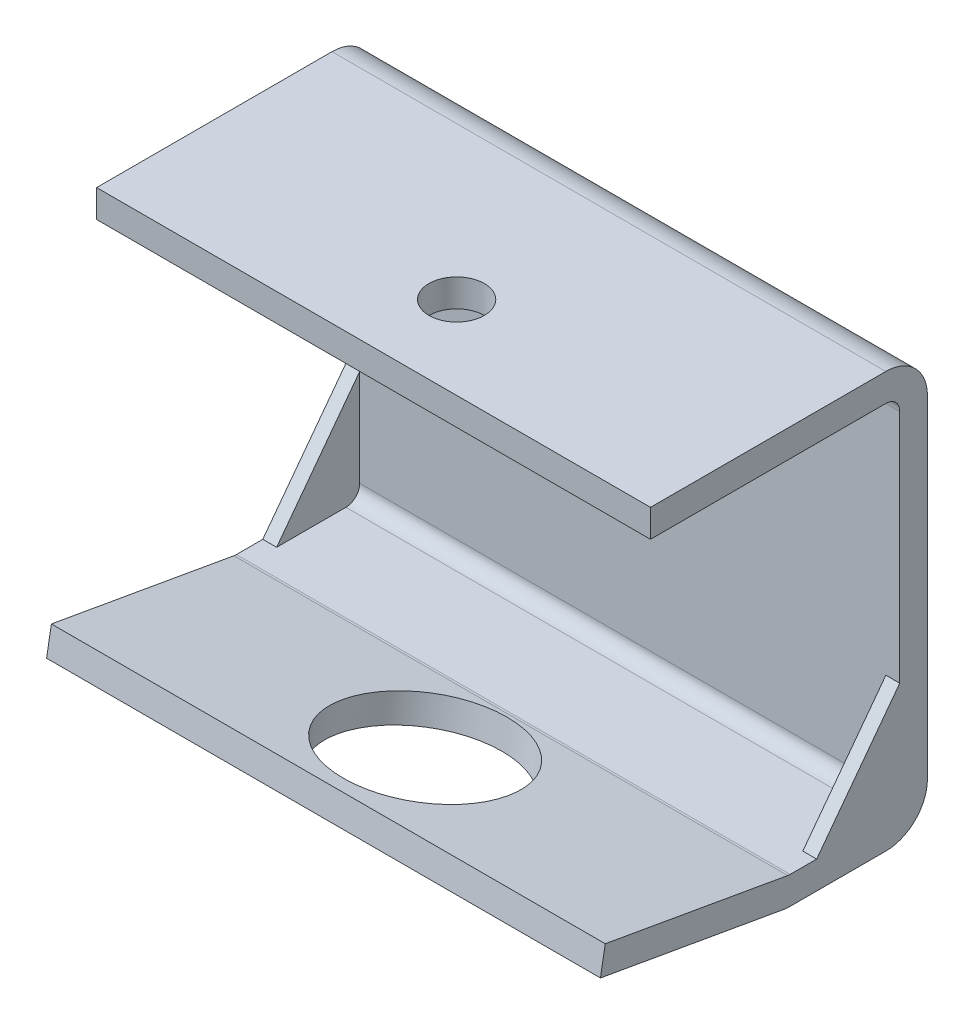
ISO-10303-21;
HEADER;
FILE_DESCRIPTION(('STEP AP214'),'2;1');
FILE_NAME('part.step','',(''),(''),'','','');
FILE_SCHEMA(('AUTOMOTIVE_DESIGN { 1 0 10303 214 1 1 1 1 }'));
ENDSEC;
DATA;
#1=APPLICATION_CONTEXT('core data for automotive mechanical design processes');
#2=APPLICATION_PROTOCOL_DEFINITION('international standard','automotive_design',2000,#1);
#3=PRODUCT_CONTEXT('',#1,'mechanical');
#4=PRODUCT('Part','Part','',(#3));
#5=PRODUCT_RELATED_PRODUCT_CATEGORY('part','',(#4));
#6=PRODUCT_DEFINITION_FORMATION('','',#4);
#7=PRODUCT_DEFINITION_CONTEXT('part definition',#1,'design');
#8=PRODUCT_DEFINITION('design','',#6,#7);
#9=PRODUCT_DEFINITION_SHAPE('','',#8);
#10=(LENGTH_UNIT() NAMED_UNIT(*) SI_UNIT(.MILLI.,.METRE.));
#11=(NAMED_UNIT(*) PLANE_ANGLE_UNIT() SI_UNIT($,.RADIAN.));
#12=(NAMED_UNIT(*) SI_UNIT($,.STERADIAN.) SOLID_ANGLE_UNIT());
#13=UNCERTAINTY_MEASURE_WITH_UNIT(LENGTH_MEASURE(1.E-05),#10,'distance_accuracy_value','');
#14=(GEOMETRIC_REPRESENTATION_CONTEXT(3) GLOBAL_UNCERTAINTY_ASSIGNED_CONTEXT((#13)) GLOBAL_UNIT_ASSIGNED_CONTEXT((#10,
#11,#12)) REPRESENTATION_CONTEXT('',''));
#15=CARTESIAN_POINT('',(0.,0.,0.));
#16=DIRECTION('',(0.,0.,1.));
#17=DIRECTION('',(1.,0.,0.));
#18=AXIS2_PLACEMENT_3D('',#15,#16,#17);
#19=CARTESIAN_POINT('',(63.5,3.175,3.175));
#20=DIRECTION('',(-1.,0.,0.));
#21=DIRECTION('',(0.,0.,1.));
#22=AXIS2_PLACEMENT_3D('',#19,#20,#21);
#23=CYLINDRICAL_SURFACE('',#22,3.175);
#24=DIRECTION('',(-1.,0.,0.));
#25=VECTOR('',#24,1.);
#26=CARTESIAN_POINT('',(63.5,3.175,0.));
#27=LINE('',#26,#25);
#28=CARTESIAN_POINT('',(60.325,3.175,0.));
#29=VERTEX_POINT('',#28);
#30=CARTESIAN_POINT('',(-60.325,3.175,0.));
#31=VERTEX_POINT('',#30);
#32=EDGE_CURVE('E331',#29,#31,#27,.T.);
#33=ORIENTED_EDGE('',*,*,#32,.T.);
#34=CARTESIAN_POINT('',(-60.325,3.175,3.175));
#35=DIRECTION('',(1.,0.,0.));
#36=DIRECTION('',(0.,0.,-1.));
#37=AXIS2_PLACEMENT_3D('',#34,#35,#36);
#38=CIRCLE('',#37,3.175);
#39=CARTESIAN_POINT('',(-60.325,0.,3.175));
#40=VERTEX_POINT('',#39);
#41=EDGE_CURVE('E203',#40,#31,#38,.T.);
#42=ORIENTED_EDGE('',*,*,#41,.F.);
#43=DIRECTION('',(-1.,0.,0.));
#44=VECTOR('',#43,1.);
#45=CARTESIAN_POINT('',(63.5,0.,3.175));
#46=LINE('',#45,#44);
#47=CARTESIAN_POINT('',(60.325,0.,3.175));
#48=VERTEX_POINT('',#47);
#49=EDGE_CURVE('E202',#48,#40,#46,.T.);
#50=ORIENTED_EDGE('',*,*,#49,.F.);
#51=CARTESIAN_POINT('',(60.325,3.175,3.175));
#52=DIRECTION('',(1.,0.,0.));
#53=DIRECTION('',(0.,0.,-1.));
#54=AXIS2_PLACEMENT_3D('',#51,#52,#53);
#55=CIRCLE('',#54,3.175);
#56=EDGE_CURVE('E214',#48,#29,#55,.T.);
#57=ORIENTED_EDGE('',*,*,#56,.T.);
#58=EDGE_LOOP('',(#33,#42,#50,#57));
#59=FACE_BOUND('',#58,.T.);
#60=ADVANCED_FACE('F43',(#59),#23,.F.);
#61=CARTESIAN_POINT('',(63.5,3.175,0.));
#62=DIRECTION('',(0.,0.,1.));
#63=DIRECTION('',(1.,0.,0.));
#64=AXIS2_PLACEMENT_3D('',#61,#62,#63);
#65=PLANE('',#64);
#66=DIRECTION('',(-1.,0.,0.));
#67=VECTOR('',#66,1.);
#68=CARTESIAN_POINT('',(-60.325,25.4,0.));
#69=LINE('',#68,#67);
#70=CARTESIAN_POINT('',(-60.325,25.4,0.));
#71=VERTEX_POINT('',#70);
#72=CARTESIAN_POINT('',(-63.5,25.4,0.));
#73=VERTEX_POINT('',#72);
#74=EDGE_CURVE('E190',#71,#73,#69,.T.);
#75=ORIENTED_EDGE('',*,*,#74,.F.);
#76=DIRECTION('',(0.,1.,0.));
#77=VECTOR('',#76,1.);
#78=CARTESIAN_POINT('',(-60.325,3.175,0.));
#79=LINE('',#78,#77);
#80=EDGE_CURVE('E197',#31,#71,#79,.T.);
#81=ORIENTED_EDGE('',*,*,#80,.F.);
#82=ORIENTED_EDGE('',*,*,#32,.F.);
#83=DIRECTION('',(0.,1.,0.));
#84=VECTOR('',#83,1.);
#85=CARTESIAN_POINT('',(60.325,3.175,0.));
#86=LINE('',#85,#84);
#87=CARTESIAN_POINT('',(60.325,25.4,0.));
#88=VERTEX_POINT('',#87);
#89=EDGE_CURVE('E67',#29,#88,#86,.T.);
#90=ORIENTED_EDGE('',*,*,#89,.T.);
#91=DIRECTION('',(1.,0.,0.));
#92=VECTOR('',#91,1.);
#93=CARTESIAN_POINT('',(60.325,25.4,0.));
#94=LINE('',#93,#92);
#95=CARTESIAN_POINT('',(63.5,25.4,0.));
#96=VERTEX_POINT('',#95);
#97=EDGE_CURVE('E223',#88,#96,#94,.T.);
#98=ORIENTED_EDGE('',*,*,#97,.T.);
#99=DIRECTION('',(0.,1.,0.));
#100=VECTOR('',#99,1.);
#101=CARTESIAN_POINT('',(63.5,3.175,0.));
#102=LINE('',#101,#100);
#103=CARTESIAN_POINT('',(63.5,79.375,0.));
#104=VERTEX_POINT('',#103);
#105=EDGE_CURVE('E244',#96,#104,#102,.T.);
#106=ORIENTED_EDGE('',*,*,#105,.T.);
#107=DIRECTION('',(-1.,0.,0.));
#108=VECTOR('',#107,1.);
#109=CARTESIAN_POINT('',(63.5,79.375,0.));
#110=LINE('',#109,#108);
#111=CARTESIAN_POINT('',(-63.5,79.375,0.));
#112=VERTEX_POINT('',#111);
#113=EDGE_CURVE('E334',#104,#112,#110,.T.);
#114=ORIENTED_EDGE('',*,*,#113,.T.);
#115=DIRECTION('',(0.,1.,0.));
#116=VECTOR('',#115,1.);
#117=CARTESIAN_POINT('',(-63.5,3.175,0.));
#118=LINE('',#117,#116);
#119=EDGE_CURVE('E281',#73,#112,#118,.T.);
#120=ORIENTED_EDGE('',*,*,#119,.F.);
#121=EDGE_LOOP('',(#75,#81,#82,#90,#98,#106,#114,#120));
#122=FACE_BOUND('',#121,.T.);
#123=ADVANCED_FACE('F424',(#122),#65,.T.);
#124=CARTESIAN_POINT('',(63.5,0.,25.1222234933052));
#125=DIRECTION('',(0.,1.,0.));
#126=DIRECTION('',(0.,0.,1.));
#127=AXIS2_PLACEMENT_3D('',#124,#125,#126);
#128=PLANE('',#127);
#129=DIRECTION('',(-1.,0.,0.));
#130=VECTOR('',#129,1.);
#131=CARTESIAN_POINT('',(-60.325,0.,19.05));
#132=LINE('',#131,#130);
#133=CARTESIAN_POINT('',(-60.325,0.,19.05));
#134=VERTEX_POINT('',#133);
#135=CARTESIAN_POINT('',(-63.5,0.,19.05));
#136=VERTEX_POINT('',#135);
#137=EDGE_CURVE('E181',#134,#136,#132,.T.);
#138=ORIENTED_EDGE('',*,*,#137,.T.);
#139=DIRECTION('',(0.,0.,-1.));
#140=VECTOR('',#139,1.);
#141=CARTESIAN_POINT('',(-63.5,0.,25.1222234933052));
#142=LINE('',#141,#140);
#143=CARTESIAN_POINT('',(-63.5,0.,25.1222234933052));
#144=VERTEX_POINT('',#143);
#145=EDGE_CURVE('E283',#144,#136,#142,.T.);
#146=ORIENTED_EDGE('',*,*,#145,.F.);
#147=DIRECTION('',(-1.,0.,0.));
#148=VECTOR('',#147,1.);
#149=CARTESIAN_POINT('',(63.5,0.,25.1222234933052));
#150=LINE('',#149,#148);
#151=CARTESIAN_POINT('',(63.5,0.,25.1222234933052));
#152=VERTEX_POINT('',#151);
#153=EDGE_CURVE('E328',#152,#144,#150,.T.);
#154=ORIENTED_EDGE('',*,*,#153,.F.);
#155=DIRECTION('',(0.,0.,-1.));
#156=VECTOR('',#155,1.);
#157=CARTESIAN_POINT('',(63.5,0.,25.1222234933052));
#158=LINE('',#157,#156);
#159=CARTESIAN_POINT('',(63.5,0.,19.05));
#160=VERTEX_POINT('',#159);
#161=EDGE_CURVE('E246',#152,#160,#158,.T.);
#162=ORIENTED_EDGE('',*,*,#161,.T.);
#163=DIRECTION('',(1.,0.,0.));
#164=VECTOR('',#163,1.);
#165=CARTESIAN_POINT('',(60.325,0.,19.05));
#166=LINE('',#165,#164);
#167=CARTESIAN_POINT('',(60.325,0.,19.05));
#168=VERTEX_POINT('',#167);
#169=EDGE_CURVE('E218',#168,#160,#166,.T.);
#170=ORIENTED_EDGE('',*,*,#169,.F.);
#171=DIRECTION('',(0.,0.,-1.));
#172=VECTOR('',#171,1.);
#173=CARTESIAN_POINT('',(60.325,0.,19.05));
#174=LINE('',#173,#172);
#175=EDGE_CURVE('E216',#168,#48,#174,.T.);
#176=ORIENTED_EDGE('',*,*,#175,.T.);
#177=ORIENTED_EDGE('',*,*,#49,.T.);
#178=DIRECTION('',(0.,0.,-1.));
#179=VECTOR('',#178,1.);
#180=CARTESIAN_POINT('',(-60.325,0.,19.05));
#181=LINE('',#180,#179);
#182=EDGE_CURVE('E194',#134,#40,#181,.T.);
#183=ORIENTED_EDGE('',*,*,#182,.F.);
#184=EDGE_LOOP('',(#138,#146,#154,#162,#170,#176,#177,#183));
#185=FACE_BOUND('',#184,.T.);
#186=ADVANCED_FACE('F200',(#185),#128,.T.);
#187=CARTESIAN_POINT('',(63.5,88.9,3.175));
#188=DIRECTION('',(0.,-1.,0.));
#189=DIRECTION('',(0.,0.,-1.));
#190=AXIS2_PLACEMENT_3D('',#187,#188,#189);
#191=PLANE('',#190);
#192=CARTESIAN_POINT('',(0.,88.9,38.1));
#193=DIRECTION('',(0.,1.,0.));
#194=DIRECTION('',(0.,0.,1.));
#195=AXIS2_PLACEMENT_3D('',#192,#193,#194);
#196=CIRCLE('',#195,6.35);
#197=CARTESIAN_POINT('',(0.,88.9,44.45));
#198=VERTEX_POINT('',#197);
#199=EDGE_CURVE('E228',#198,#198,#196,.T.);
#200=ORIENTED_EDGE('',*,*,#199,.F.);
#201=EDGE_LOOP('',(#200));
#202=FACE_BOUND('',#201,.T.);
#203=DIRECTION('',(0.,0.,1.));
#204=VECTOR('',#203,1.);
#205=CARTESIAN_POINT('',(-63.5,88.9,3.175));
#206=LINE('',#205,#204);
#207=CARTESIAN_POINT('',(-63.5,88.9,3.175));
#208=VERTEX_POINT('',#207);
#209=CARTESIAN_POINT('',(-63.5,88.9,57.15));
#210=VERTEX_POINT('',#209);
#211=EDGE_CURVE('E231',#208,#210,#206,.T.);
#212=ORIENTED_EDGE('',*,*,#211,.T.);
#213=DIRECTION('',(-1.,0.,0.));
#214=VECTOR('',#213,1.);
#215=CARTESIAN_POINT('',(63.5,88.9,57.15));
#216=LINE('',#215,#214);
#217=CARTESIAN_POINT('',(63.5,88.9,57.15));
#218=VERTEX_POINT('',#217);
#219=EDGE_CURVE('E13',#218,#210,#216,.T.);
#220=ORIENTED_EDGE('',*,*,#219,.F.);
#221=DIRECTION('',(0.,0.,1.));
#222=VECTOR('',#221,1.);
#223=CARTESIAN_POINT('',(63.5,88.9,3.175));
#224=LINE('',#223,#222);
#225=CARTESIAN_POINT('',(63.5,88.9,3.175));
#226=VERTEX_POINT('',#225);
#227=EDGE_CURVE('E232',#226,#218,#224,.T.);
#228=ORIENTED_EDGE('',*,*,#227,.F.);
#229=DIRECTION('',(-1.,0.,0.));
#230=VECTOR('',#229,1.);
#231=CARTESIAN_POINT('',(63.5,88.9,3.175));
#232=LINE('',#231,#230);
#233=EDGE_CURVE('E269',#226,#208,#232,.T.);
#234=ORIENTED_EDGE('',*,*,#233,.T.);
#235=EDGE_LOOP('',(#212,#220,#228,#234));
#236=FACE_BOUND('',#235,.T.);
#237=ADVANCED_FACE('F45',(#202,#236),#191,.F.);
#238=CARTESIAN_POINT('',(63.5,82.55,57.15));
#239=DIRECTION('',(0.,0.,1.));
#240=DIRECTION('',(1.,0.,0.));
#241=AXIS2_PLACEMENT_3D('',#238,#239,#240);
#242=PLANE('',#241);
#243=DIRECTION('',(0.,1.,0.));
#244=VECTOR('',#243,1.);
#245=CARTESIAN_POINT('',(-63.5,82.55,57.15));
#246=LINE('',#245,#244);
#247=CARTESIAN_POINT('',(-63.5,82.55,57.15));
#248=VERTEX_POINT('',#247);
#249=EDGE_CURVE('E272',#248,#210,#246,.T.);
#250=ORIENTED_EDGE('',*,*,#249,.F.);
#251=DIRECTION('',(-1.,0.,0.));
#252=VECTOR('',#251,1.);
#253=CARTESIAN_POINT('',(63.5,82.55,57.15));
#254=LINE('',#253,#252);
#255=CARTESIAN_POINT('',(63.5,82.55,57.15));
#256=VERTEX_POINT('',#255);
#257=EDGE_CURVE('E52',#256,#248,#254,.T.);
#258=ORIENTED_EDGE('',*,*,#257,.F.);
#259=DIRECTION('',(0.,1.,0.));
#260=VECTOR('',#259,1.);
#261=CARTESIAN_POINT('',(63.5,82.55,57.15));
#262=LINE('',#261,#260);
#263=EDGE_CURVE('E234',#256,#218,#262,.T.);
#264=ORIENTED_EDGE('',*,*,#263,.T.);
#265=ORIENTED_EDGE('',*,*,#219,.T.);
#266=EDGE_LOOP('',(#250,#258,#264,#265));
#267=FACE_BOUND('',#266,.T.);
#268=ADVANCED_FACE('F346',(#267),#242,.T.);
#269=CARTESIAN_POINT('',(63.5,82.55,3.175));
#270=DIRECTION('',(0.,-1.,0.));
#271=DIRECTION('',(0.,0.,-1.));
#272=AXIS2_PLACEMENT_3D('',#269,#270,#271);
#273=PLANE('',#272);
#274=CARTESIAN_POINT('',(0.,82.55,38.1));
#275=DIRECTION('',(0.,-1.,0.));
#276=DIRECTION('',(0.,0.,-1.));
#277=AXIS2_PLACEMENT_3D('',#274,#275,#276);
#278=CIRCLE('',#277,6.35);
#279=CARTESIAN_POINT('',(0.,82.55,31.75));
#280=VERTEX_POINT('',#279);
#281=EDGE_CURVE('E225',#280,#280,#278,.F.);
#282=ORIENTED_EDGE('',*,*,#281,.T.);
#283=EDGE_LOOP('',(#282));
#284=FACE_BOUND('',#283,.T.);
#285=DIRECTION('',(0.,0.,1.));
#286=VECTOR('',#285,1.);
#287=CARTESIAN_POINT('',(-63.5,82.55,3.175));
#288=LINE('',#287,#286);
#289=CARTESIAN_POINT('',(-63.5,82.55,3.175));
#290=VERTEX_POINT('',#289);
#291=EDGE_CURVE('E275',#290,#248,#288,.T.);
#292=ORIENTED_EDGE('',*,*,#291,.F.);
#293=DIRECTION('',(-1.,0.,0.));
#294=VECTOR('',#293,1.);
#295=CARTESIAN_POINT('',(63.5,82.55,3.175));
#296=LINE('',#295,#294);
#297=CARTESIAN_POINT('',(63.5,82.55,3.175));
#298=VERTEX_POINT('',#297);
#299=EDGE_CURVE('E337',#298,#290,#296,.T.);
#300=ORIENTED_EDGE('',*,*,#299,.F.);
#301=DIRECTION('',(0.,0.,1.));
#302=VECTOR('',#301,1.);
#303=CARTESIAN_POINT('',(63.5,82.55,3.175));
#304=LINE('',#303,#302);
#305=EDGE_CURVE('E238',#298,#256,#304,.T.);
#306=ORIENTED_EDGE('',*,*,#305,.T.);
#307=ORIENTED_EDGE('',*,*,#257,.T.);
#308=EDGE_LOOP('',(#292,#300,#306,#307));
#309=FACE_BOUND('',#308,.T.);
#310=ADVANCED_FACE('F342',(#284,#309),#273,.T.);
#311=CARTESIAN_POINT('',(63.5,79.375,3.175));
#312=DIRECTION('',(-1.,0.,0.));
#313=DIRECTION('',(0.,0.,1.));
#314=AXIS2_PLACEMENT_3D('',#311,#312,#313);
#315=CYLINDRICAL_SURFACE('',#314,3.175);
#316=CARTESIAN_POINT('',(-63.5,79.375,3.175));
#317=DIRECTION('',(1.,0.,0.));
#318=DIRECTION('',(0.,0.,-1.));
#319=AXIS2_PLACEMENT_3D('',#316,#317,#318);
#320=CIRCLE('',#319,3.175);
#321=EDGE_CURVE('E278',#112,#290,#320,.T.);
#322=ORIENTED_EDGE('',*,*,#321,.F.);
#323=ORIENTED_EDGE('',*,*,#113,.F.);
#324=CARTESIAN_POINT('',(63.5,79.375,3.175));
#325=DIRECTION('',(1.,0.,0.));
#326=DIRECTION('',(0.,0.,-1.));
#327=AXIS2_PLACEMENT_3D('',#324,#325,#326);
#328=CIRCLE('',#327,3.175);
#329=EDGE_CURVE('E241',#104,#298,#328,.T.);
#330=ORIENTED_EDGE('',*,*,#329,.T.);
#331=ORIENTED_EDGE('',*,*,#299,.T.);
#332=EDGE_LOOP('',(#322,#323,#330,#331));
#333=FACE_BOUND('',#332,.T.);
#334=ADVANCED_FACE('F354',(#333),#315,.F.);
#335=CARTESIAN_POINT('',(63.5,3.175,25.1222234933052));
#336=DIRECTION('',(-1.,0.,0.));
#337=DIRECTION('',(0.,0.,1.));
#338=AXIS2_PLACEMENT_3D('',#335,#336,#337);
#339=CYLINDRICAL_SURFACE('',#338,3.175);
#340=CARTESIAN_POINT('',(-63.5,3.175,25.1222234933052));
#341=DIRECTION('',(1.,0.,0.));
#342=DIRECTION('',(0.,0.,-1.));
#343=AXIS2_PLACEMENT_3D('',#340,#341,#342);
#344=CIRCLE('',#343,3.175);
#345=CARTESIAN_POINT('',(-63.5,0.0482353841862421,25.6735564573977));
#346=VERTEX_POINT('',#345);
#347=EDGE_CURVE('E285',#346,#144,#344,.T.);
#348=ORIENTED_EDGE('',*,*,#347,.F.);
#349=DIRECTION('',(-1.,0.,0.));
#350=VECTOR('',#349,1.);
#351=CARTESIAN_POINT('',(63.5,0.0482353841862421,25.6735564573977));
#352=LINE('',#351,#350);
#353=CARTESIAN_POINT('',(63.5,0.0482353841862421,25.6735564573977));
#354=VERTEX_POINT('',#353);
#355=EDGE_CURVE('E326',#354,#346,#352,.T.);
#356=ORIENTED_EDGE('',*,*,#355,.F.);
#357=CARTESIAN_POINT('',(63.5,3.175,25.1222234933052));
#358=DIRECTION('',(1.,0.,0.));
#359=DIRECTION('',(0.,0.,-1.));
#360=AXIS2_PLACEMENT_3D('',#357,#358,#359);
#361=CIRCLE('',#360,3.175);
#362=EDGE_CURVE('E248',#354,#152,#361,.T.);
#363=ORIENTED_EDGE('',*,*,#362,.T.);
#364=ORIENTED_EDGE('',*,*,#153,.T.);
#365=EDGE_LOOP('',(#348,#356,#363,#364));
#366=FACE_BOUND('',#365,.T.);
#367=ADVANCED_FACE('F401',(#366),#339,.F.);
#368=CARTESIAN_POINT('',(63.5,7.42755769225423,67.523772904243));
#369=DIRECTION('',(0.,0.984807753012208,-0.173648177666931));
#370=DIRECTION('',(0.,0.173648177666931,0.984807753012208));
#371=AXIS2_PLACEMENT_3D('',#368,#369,#370);
#372=PLANE('',#371);
#373=CARTESIAN_POINT('',(-3.42687350455541E-13,3.51215941315118,45.3184458274035));
#374=DIRECTION('',(0.,0.984807753012208,-0.173648177666931));
#375=DIRECTION('',(0.,0.173648177666931,0.984807753012208));
#376=AXIS2_PLACEMENT_3D('',#373,#374,#375);
#377=CIRCLE('',#376,19.05);
#378=CARTESIAN_POINT('',(-3.42687350455541E-13,6.82015719770621,64.079033522286));
#379=VERTEX_POINT('',#378);
#380=EDGE_CURVE('E558',#379,#379,#377,.T.);
#381=ORIENTED_EDGE('',*,*,#380,.F.);
#382=EDGE_LOOP('',(#381));
#383=FACE_BOUND('',#382,.T.);
#384=DIRECTION('',(0.,-0.173648177666931,-0.984807753012208));
#385=VECTOR('',#384,1.);
#386=CARTESIAN_POINT('',(-63.5,7.42755769225423,67.523772904243));
#387=LINE('',#386,#385);
#388=CARTESIAN_POINT('',(-63.5,7.42755769225423,67.523772904243));
#389=VERTEX_POINT('',#388);
#390=EDGE_CURVE('E288',#389,#346,#387,.T.);
#391=ORIENTED_EDGE('',*,*,#390,.F.);
#392=DIRECTION('',(-1.,0.,0.));
#393=VECTOR('',#392,1.);
#394=CARTESIAN_POINT('',(63.5,7.42755769225423,67.523772904243));
#395=LINE('',#394,#393);
#396=CARTESIAN_POINT('',(63.5,7.42755769225423,67.523772904243));
#397=VERTEX_POINT('',#396);
#398=EDGE_CURVE('E324',#397,#389,#395,.T.);
#399=ORIENTED_EDGE('',*,*,#398,.F.);
#400=DIRECTION('',(0.,-0.173648177666931,-0.984807753012208));
#401=VECTOR('',#400,1.);
#402=CARTESIAN_POINT('',(63.5,7.42755769225423,67.523772904243));
#403=LINE('',#402,#401);
#404=EDGE_CURVE('E251',#397,#354,#403,.T.);
#405=ORIENTED_EDGE('',*,*,#404,.T.);
#406=ORIENTED_EDGE('',*,*,#355,.T.);
#407=EDGE_LOOP('',(#391,#399,#405,#406));
#408=FACE_BOUND('',#407,.T.);
#409=ADVANCED_FACE('F398',(#383,#408),#372,.T.);
#410=CARTESIAN_POINT('',(63.5,1.17402846062671,68.626438832428));
#411=DIRECTION('',(0.,0.17364817766693,0.984807753012208));
#412=DIRECTION('',(0.,-0.984807753012208,0.17364817766693));
#413=AXIS2_PLACEMENT_3D('',#410,#411,#412);
#414=PLANE('',#413);
#415=DIRECTION('',(0.,0.984807753012208,-0.17364817766693));
#416=VECTOR('',#415,1.);
#417=CARTESIAN_POINT('',(-63.5,1.17402846062671,68.626438832428));
#418=LINE('',#417,#416);
#419=CARTESIAN_POINT('',(-63.5,1.17402846062671,68.626438832428));
#420=VERTEX_POINT('',#419);
#421=EDGE_CURVE('E291',#420,#389,#418,.T.);
#422=ORIENTED_EDGE('',*,*,#421,.F.);
#423=DIRECTION('',(-1.,0.,0.));
#424=VECTOR('',#423,1.);
#425=CARTESIAN_POINT('',(63.5,1.17402846062671,68.626438832428));
#426=LINE('',#425,#424);
#427=CARTESIAN_POINT('',(63.5,1.17402846062671,68.626438832428));
#428=VERTEX_POINT('',#427);
#429=EDGE_CURVE('E322',#428,#420,#426,.T.);
#430=ORIENTED_EDGE('',*,*,#429,.F.);
#431=DIRECTION('',(0.,0.984807753012208,-0.17364817766693));
#432=VECTOR('',#431,1.);
#433=CARTESIAN_POINT('',(63.5,1.17402846062671,68.626438832428));
#434=LINE('',#433,#432);
#435=EDGE_CURVE('E254',#428,#397,#434,.T.);
#436=ORIENTED_EDGE('',*,*,#435,.T.);
#437=ORIENTED_EDGE('',*,*,#398,.T.);
#438=EDGE_LOOP('',(#422,#430,#436,#437));
#439=FACE_BOUND('',#438,.T.);
#440=ADVANCED_FACE('F394',(#439),#414,.T.);
#441=CARTESIAN_POINT('',(63.5,1.17402846062671,68.626438832428));
#442=DIRECTION('',(0.,0.984807753012208,-0.173648177666931));
#443=DIRECTION('',(0.,0.173648177666931,0.984807753012208));
#444=AXIS2_PLACEMENT_3D('',#441,#442,#443);
#445=PLANE('',#444);
#446=CARTESIAN_POINT('',(-3.42687350455541E-13,-2.74136981847633,46.4211117555885));
#447=DIRECTION('',(0.,0.984807753012208,-0.173648177666931));
#448=DIRECTION('',(0.,0.173648177666931,0.984807753012208));
#449=AXIS2_PLACEMENT_3D('',#446,#447,#448);
#450=CIRCLE('',#449,19.05);
#451=CARTESIAN_POINT('',(-3.42687350455541E-13,0.566627966078688,65.181699450471));
#452=VERTEX_POINT('',#451);
#453=EDGE_CURVE('E47',#452,#452,#450,.T.);
#454=ORIENTED_EDGE('',*,*,#453,.T.);
#455=EDGE_LOOP('',(#454));
#456=FACE_BOUND('',#455,.T.);
#457=DIRECTION('',(0.,-0.173648177666931,-0.984807753012208));
#458=VECTOR('',#457,1.);
#459=CARTESIAN_POINT('',(-63.5,1.17402846062671,68.626438832428));
#460=LINE('',#459,#458);
#461=CARTESIAN_POINT('',(-63.5,-6.20529384744127,26.7762223855827));
#462=VERTEX_POINT('',#461);
#463=EDGE_CURVE('E294',#420,#462,#460,.T.);
#464=ORIENTED_EDGE('',*,*,#463,.T.);
#465=DIRECTION('',(-1.,0.,0.));
#466=VECTOR('',#465,1.);
#467=CARTESIAN_POINT('',(63.5,-6.20529384744127,26.7762223855827));
#468=LINE('',#467,#466);
#469=CARTESIAN_POINT('',(63.5,-6.20529384744127,26.7762223855827));
#470=VERTEX_POINT('',#469);
#471=EDGE_CURVE('E319',#470,#462,#468,.T.);
#472=ORIENTED_EDGE('',*,*,#471,.F.);
#473=DIRECTION('',(0.,-0.173648177666931,-0.984807753012208));
#474=VECTOR('',#473,1.);
#475=CARTESIAN_POINT('',(63.5,1.17402846062671,68.626438832428));
#476=LINE('',#475,#474);
#477=EDGE_CURVE('E257',#428,#470,#476,.T.);
#478=ORIENTED_EDGE('',*,*,#477,.F.);
#479=ORIENTED_EDGE('',*,*,#429,.T.);
#480=EDGE_LOOP('',(#464,#472,#478,#479));
#481=FACE_BOUND('',#480,.T.);
#482=ADVANCED_FACE('F390',(#456,#481),#445,.F.);
#483=CARTESIAN_POINT('',(63.5,3.175,25.1222234933052));
#484=DIRECTION('',(-1.,0.,0.));
#485=DIRECTION('',(0.,0.,1.));
#486=AXIS2_PLACEMENT_3D('',#483,#484,#485);
#487=CYLINDRICAL_SURFACE('',#486,9.525);
#488=CARTESIAN_POINT('',(-63.5,3.175,25.1222234933052));
#489=DIRECTION('',(1.,0.,0.));
#490=DIRECTION('',(0.,0.,-1.));
#491=AXIS2_PLACEMENT_3D('',#488,#489,#490);
#492=CIRCLE('',#491,9.525);
#493=CARTESIAN_POINT('',(-63.5,-6.35,25.1222234933052));
#494=VERTEX_POINT('',#493);
#495=EDGE_CURVE('E296',#462,#494,#492,.T.);
#496=ORIENTED_EDGE('',*,*,#495,.T.);
#497=DIRECTION('',(-1.,0.,0.));
#498=VECTOR('',#497,1.);
#499=CARTESIAN_POINT('',(63.5,-6.35,25.1222234933052));
#500=LINE('',#499,#498);
#501=CARTESIAN_POINT('',(63.5,-6.35,25.1222234933052));
#502=VERTEX_POINT('',#501);
#503=EDGE_CURVE('E316',#502,#494,#500,.T.);
#504=ORIENTED_EDGE('',*,*,#503,.F.);
#505=CARTESIAN_POINT('',(63.5,3.175,25.1222234933052));
#506=DIRECTION('',(1.,0.,0.));
#507=DIRECTION('',(0.,0.,-1.));
#508=AXIS2_PLACEMENT_3D('',#505,#506,#507);
#509=CIRCLE('',#508,9.525);
#510=EDGE_CURVE('E259',#470,#502,#509,.T.);
#511=ORIENTED_EDGE('',*,*,#510,.F.);
#512=ORIENTED_EDGE('',*,*,#471,.T.);
#513=EDGE_LOOP('',(#496,#504,#511,#512));
#514=FACE_BOUND('',#513,.T.);
#515=ADVANCED_FACE('F386',(#514),#487,.T.);
#516=CARTESIAN_POINT('',(63.5,-6.35,25.1222234933052));
#517=DIRECTION('',(0.,1.,0.));
#518=DIRECTION('',(0.,0.,1.));
#519=AXIS2_PLACEMENT_3D('',#516,#517,#518);
#520=PLANE('',#519);
#521=DIRECTION('',(0.,0.,-1.));
#522=VECTOR('',#521,1.);
#523=CARTESIAN_POINT('',(-63.5,-6.35,25.1222234933052));
#524=LINE('',#523,#522);
#525=CARTESIAN_POINT('',(-63.5,-6.35,3.175));
#526=VERTEX_POINT('',#525);
#527=EDGE_CURVE('E298',#494,#526,#524,.T.);
#528=ORIENTED_EDGE('',*,*,#527,.T.);
#529=DIRECTION('',(-1.,0.,0.));
#530=VECTOR('',#529,1.);
#531=CARTESIAN_POINT('',(63.5,-6.35,3.175));
#532=LINE('',#531,#530);
#533=CARTESIAN_POINT('',(63.5,-6.35,3.175));
#534=VERTEX_POINT('',#533);
#535=EDGE_CURVE('E313',#534,#526,#532,.T.);
#536=ORIENTED_EDGE('',*,*,#535,.F.);
#537=DIRECTION('',(0.,0.,-1.));
#538=VECTOR('',#537,1.);
#539=CARTESIAN_POINT('',(63.5,-6.35,25.1222234933052));
#540=LINE('',#539,#538);
#541=EDGE_CURVE('E261',#502,#534,#540,.T.);
#542=ORIENTED_EDGE('',*,*,#541,.F.);
#543=ORIENTED_EDGE('',*,*,#503,.T.);
#544=EDGE_LOOP('',(#528,#536,#542,#543));
#545=FACE_BOUND('',#544,.T.);
#546=ADVANCED_FACE('F381',(#545),#520,.F.);
#547=CARTESIAN_POINT('',(63.5,3.175,3.175));
#548=DIRECTION('',(-1.,0.,0.));
#549=DIRECTION('',(0.,0.,1.));
#550=AXIS2_PLACEMENT_3D('',#547,#548,#549);
#551=CYLINDRICAL_SURFACE('',#550,9.525);
#552=CARTESIAN_POINT('',(-63.5,3.175,3.175));
#553=DIRECTION('',(1.,0.,0.));
#554=DIRECTION('',(0.,0.,-1.));
#555=AXIS2_PLACEMENT_3D('',#552,#553,#554);
#556=CIRCLE('',#555,9.525);
#557=CARTESIAN_POINT('',(-63.5,3.175,-6.35));
#558=VERTEX_POINT('',#557);
#559=EDGE_CURVE('E300',#526,#558,#556,.T.);
#560=ORIENTED_EDGE('',*,*,#559,.T.);
#561=DIRECTION('',(-1.,0.,0.));
#562=VECTOR('',#561,1.);
#563=CARTESIAN_POINT('',(63.5,3.175,-6.35));
#564=LINE('',#563,#562);
#565=CARTESIAN_POINT('',(63.5,3.175,-6.35));
#566=VERTEX_POINT('',#565);
#567=EDGE_CURVE('E310',#566,#558,#564,.T.);
#568=ORIENTED_EDGE('',*,*,#567,.F.);
#569=CARTESIAN_POINT('',(63.5,3.175,3.175));
#570=DIRECTION('',(1.,0.,0.));
#571=DIRECTION('',(0.,0.,-1.));
#572=AXIS2_PLACEMENT_3D('',#569,#570,#571);
#573=CIRCLE('',#572,9.525);
#574=EDGE_CURVE('E263',#534,#566,#573,.T.);
#575=ORIENTED_EDGE('',*,*,#574,.F.);
#576=ORIENTED_EDGE('',*,*,#535,.T.);
#577=EDGE_LOOP('',(#560,#568,#575,#576));
#578=FACE_BOUND('',#577,.T.);
#579=ADVANCED_FACE('F375',(#578),#551,.T.);
#580=CARTESIAN_POINT('',(63.5,3.175,-6.35));
#581=DIRECTION('',(0.,0.,1.));
#582=DIRECTION('',(1.,0.,0.));
#583=AXIS2_PLACEMENT_3D('',#580,#581,#582);
#584=PLANE('',#583);
#585=DIRECTION('',(0.,1.,0.));
#586=VECTOR('',#585,1.);
#587=CARTESIAN_POINT('',(-63.5,3.175,-6.35));
#588=LINE('',#587,#586);
#589=CARTESIAN_POINT('',(-63.5,79.375,-6.35));
#590=VERTEX_POINT('',#589);
#591=EDGE_CURVE('E302',#558,#590,#588,.T.);
#592=ORIENTED_EDGE('',*,*,#591,.T.);
#593=DIRECTION('',(-1.,0.,0.));
#594=VECTOR('',#593,1.);
#595=CARTESIAN_POINT('',(63.5,79.375,-6.35));
#596=LINE('',#595,#594);
#597=CARTESIAN_POINT('',(63.5,79.375,-6.35));
#598=VERTEX_POINT('',#597);
#599=EDGE_CURVE('E307',#598,#590,#596,.T.);
#600=ORIENTED_EDGE('',*,*,#599,.F.);
#601=DIRECTION('',(0.,1.,0.));
#602=VECTOR('',#601,1.);
#603=CARTESIAN_POINT('',(63.5,3.175,-6.35));
#604=LINE('',#603,#602);
#605=EDGE_CURVE('E265',#566,#598,#604,.T.);
#606=ORIENTED_EDGE('',*,*,#605,.F.);
#607=ORIENTED_EDGE('',*,*,#567,.T.);
#608=EDGE_LOOP('',(#592,#600,#606,#607));
#609=FACE_BOUND('',#608,.T.);
#610=ADVANCED_FACE('F371',(#609),#584,.F.);
#611=CARTESIAN_POINT('',(63.5,79.375,3.175));
#612=DIRECTION('',(-1.,0.,0.));
#613=DIRECTION('',(0.,0.,1.));
#614=AXIS2_PLACEMENT_3D('',#611,#612,#613);
#615=CYLINDRICAL_SURFACE('',#614,9.525);
#616=CARTESIAN_POINT('',(-63.5,79.375,3.175));
#617=DIRECTION('',(1.,0.,0.));
#618=DIRECTION('',(0.,0.,-1.));
#619=AXIS2_PLACEMENT_3D('',#616,#617,#618);
#620=CIRCLE('',#619,9.525);
#621=EDGE_CURVE('E235',#590,#208,#620,.T.);
#622=ORIENTED_EDGE('',*,*,#621,.T.);
#623=ORIENTED_EDGE('',*,*,#233,.F.);
#624=CARTESIAN_POINT('',(63.5,79.375,3.175));
#625=DIRECTION('',(1.,0.,0.));
#626=DIRECTION('',(0.,0.,-1.));
#627=AXIS2_PLACEMENT_3D('',#624,#625,#626);
#628=CIRCLE('',#627,9.525);
#629=EDGE_CURVE('E267',#598,#226,#628,.T.);
#630=ORIENTED_EDGE('',*,*,#629,.F.);
#631=ORIENTED_EDGE('',*,*,#599,.T.);
#632=EDGE_LOOP('',(#622,#623,#630,#631));
#633=FACE_BOUND('',#632,.T.);
#634=ADVANCED_FACE('F367',(#633),#615,.T.);
#635=CARTESIAN_POINT('',(63.5,79.375,3.175));
#636=DIRECTION('',(1.,0.,0.));
#637=DIRECTION('',(0.,0.,-1.));
#638=AXIS2_PLACEMENT_3D('',#635,#636,#637);
#639=PLANE('',#638);
#640=ORIENTED_EDGE('',*,*,#105,.F.);
#641=DIRECTION('',(0.,0.8,-0.6));
#642=VECTOR('',#641,1.);
#643=CARTESIAN_POINT('',(63.5,0.,19.05));
#644=LINE('',#643,#642);
#645=EDGE_CURVE('E189',#160,#96,#644,.T.);
#646=ORIENTED_EDGE('',*,*,#645,.F.);
#647=ORIENTED_EDGE('',*,*,#161,.F.);
#648=ORIENTED_EDGE('',*,*,#362,.F.);
#649=ORIENTED_EDGE('',*,*,#404,.F.);
#650=ORIENTED_EDGE('',*,*,#435,.F.);
#651=ORIENTED_EDGE('',*,*,#477,.T.);
#652=ORIENTED_EDGE('',*,*,#510,.T.);
#653=ORIENTED_EDGE('',*,*,#541,.T.);
#654=ORIENTED_EDGE('',*,*,#574,.T.);
#655=ORIENTED_EDGE('',*,*,#605,.T.);
#656=ORIENTED_EDGE('',*,*,#629,.T.);
#657=ORIENTED_EDGE('',*,*,#227,.T.);
#658=ORIENTED_EDGE('',*,*,#263,.F.);
#659=ORIENTED_EDGE('',*,*,#305,.F.);
#660=ORIENTED_EDGE('',*,*,#329,.F.);
#661=EDGE_LOOP('',(#640,#646,#647,#648,#649,#650,#651,#652,#653,#654,#655,#656,#657,#658,#659,#660));
#662=FACE_BOUND('',#661,.T.);
#663=ADVANCED_FACE('F358',(#662),#639,.T.);
#664=CARTESIAN_POINT('',(-63.5,79.375,3.175));
#665=DIRECTION('',(1.,0.,0.));
#666=DIRECTION('',(0.,0.,-1.));
#667=AXIS2_PLACEMENT_3D('',#664,#665,#666);
#668=PLANE('',#667);
#669=ORIENTED_EDGE('',*,*,#211,.F.);
#670=ORIENTED_EDGE('',*,*,#621,.F.);
#671=ORIENTED_EDGE('',*,*,#591,.F.);
#672=ORIENTED_EDGE('',*,*,#559,.F.);
#673=ORIENTED_EDGE('',*,*,#527,.F.);
#674=ORIENTED_EDGE('',*,*,#495,.F.);
#675=ORIENTED_EDGE('',*,*,#463,.F.);
#676=ORIENTED_EDGE('',*,*,#421,.T.);
#677=ORIENTED_EDGE('',*,*,#390,.T.);
#678=ORIENTED_EDGE('',*,*,#347,.T.);
#679=ORIENTED_EDGE('',*,*,#145,.T.);
#680=DIRECTION('',(0.,0.8,-0.6));
#681=VECTOR('',#680,1.);
#682=CARTESIAN_POINT('',(-63.5,0.,19.05));
#683=LINE('',#682,#681);
#684=EDGE_CURVE('E59',#136,#73,#683,.T.);
#685=ORIENTED_EDGE('',*,*,#684,.T.);
#686=ORIENTED_EDGE('',*,*,#119,.T.);
#687=ORIENTED_EDGE('',*,*,#321,.T.);
#688=ORIENTED_EDGE('',*,*,#291,.T.);
#689=ORIENTED_EDGE('',*,*,#249,.T.);
#690=EDGE_LOOP('',(#669,#670,#671,#672,#673,#674,#675,#676,#677,#678,#679,#685,#686,#687,#688,#689));
#691=FACE_BOUND('',#690,.T.);
#692=ADVANCED_FACE('F349',(#691),#668,.F.);
#693=CARTESIAN_POINT('',(0.,-6.35100000000001,38.1000000000001));
#694=DIRECTION('',(0.,1.,0.));
#695=DIRECTION('',(0.,0.,1.));
#696=AXIS2_PLACEMENT_3D('',#693,#694,#695);
#697=CYLINDRICAL_SURFACE('',#696,6.35);
#698=ORIENTED_EDGE('',*,*,#281,.F.);
#699=EDGE_LOOP('',(#698));
#700=FACE_BOUND('',#699,.T.);
#701=ORIENTED_EDGE('',*,*,#199,.T.);
#702=EDGE_LOOP('',(#701));
#703=FACE_BOUND('',#702,.T.);
#704=ADVANCED_FACE('F421',(#700,#703),#697,.F.);
#705=CARTESIAN_POINT('',(60.325,0.,19.05));
#706=DIRECTION('',(0.,-0.6,-0.8));
#707=DIRECTION('',(0.,0.8,-0.6));
#708=AXIS2_PLACEMENT_3D('',#705,#706,#707);
#709=PLANE('',#708);
#710=ORIENTED_EDGE('',*,*,#645,.T.);
#711=ORIENTED_EDGE('',*,*,#97,.F.);
#712=DIRECTION('',(0.,0.8,-0.6));
#713=VECTOR('',#712,1.);
#714=CARTESIAN_POINT('',(60.325,0.,19.05));
#715=LINE('',#714,#713);
#716=EDGE_CURVE('E211',#168,#88,#715,.T.);
#717=ORIENTED_EDGE('',*,*,#716,.F.);
#718=ORIENTED_EDGE('',*,*,#169,.T.);
#719=EDGE_LOOP('',(#710,#711,#717,#718));
#720=FACE_BOUND('',#719,.T.);
#721=ADVANCED_FACE('F407',(#720),#709,.F.);
#722=CARTESIAN_POINT('',(60.325,3.175,3.175));
#723=DIRECTION('',(1.,0.,0.));
#724=DIRECTION('',(0.,0.,-1.));
#725=AXIS2_PLACEMENT_3D('',#722,#723,#724);
#726=PLANE('',#725);
#727=ORIENTED_EDGE('',*,*,#716,.T.);
#728=ORIENTED_EDGE('',*,*,#89,.F.);
#729=ORIENTED_EDGE('',*,*,#56,.F.);
#730=ORIENTED_EDGE('',*,*,#175,.F.);
#731=EDGE_LOOP('',(#727,#728,#729,#730));
#732=FACE_BOUND('',#731,.T.);
#733=ADVANCED_FACE('F413',(#732),#726,.F.);
#734=CARTESIAN_POINT('',(-60.325,0.,19.05));
#735=DIRECTION('',(0.,0.6,0.8));
#736=DIRECTION('',(0.,-0.8,0.6));
#737=AXIS2_PLACEMENT_3D('',#734,#735,#736);
#738=PLANE('',#737);
#739=ORIENTED_EDGE('',*,*,#684,.F.);
#740=ORIENTED_EDGE('',*,*,#137,.F.);
#741=DIRECTION('',(0.,0.8,-0.6));
#742=VECTOR('',#741,1.);
#743=CARTESIAN_POINT('',(-60.325,0.,19.05));
#744=LINE('',#743,#742);
#745=EDGE_CURVE('E184',#134,#71,#744,.T.);
#746=ORIENTED_EDGE('',*,*,#745,.T.);
#747=ORIENTED_EDGE('',*,*,#74,.T.);
#748=EDGE_LOOP('',(#739,#740,#746,#747));
#749=FACE_BOUND('',#748,.T.);
#750=ADVANCED_FACE('F183',(#749),#738,.T.);
#751=CARTESIAN_POINT('',(-60.325,3.175,3.175));
#752=DIRECTION('',(-1.,0.,0.));
#753=DIRECTION('',(0.,0.,-1.));
#754=AXIS2_PLACEMENT_3D('',#751,#752,#753);
#755=PLANE('',#754);
#756=ORIENTED_EDGE('',*,*,#745,.F.);
#757=ORIENTED_EDGE('',*,*,#182,.T.);
#758=ORIENTED_EDGE('',*,*,#41,.T.);
#759=ORIENTED_EDGE('',*,*,#80,.T.);
#760=EDGE_LOOP('',(#756,#757,#758,#759));
#761=FACE_BOUND('',#760,.T.);
#762=ADVANCED_FACE('F193',(#761),#755,.F.);
#763=CARTESIAN_POINT('',(-3.42687350455541E-13,-10.0385210603067,47.7077964018335));
#764=DIRECTION('',(0.,0.984807753012208,-0.173648177666931));
#765=DIRECTION('',(0.,0.173648177666931,0.984807753012208));
#766=AXIS2_PLACEMENT_3D('',#763,#764,#765);
#767=CYLINDRICAL_SURFACE('',#766,19.05);
#768=ORIENTED_EDGE('',*,*,#380,.T.);
#769=EDGE_LOOP('',(#768));
#770=FACE_BOUND('',#769,.T.);
#771=ORIENTED_EDGE('',*,*,#453,.F.);
#772=EDGE_LOOP('',(#771));
#773=FACE_BOUND('',#772,.T.);
#774=ADVANCED_FACE('F542',(#770,#773),#767,.F.);
#775=CLOSED_SHELL('',(#60,#123,#186,#237,#268,#310,#334,#367,#409,#440,#482,#515,#546,#579,#610,
#634,#663,#692,#704,#721,#733,#750,#762,#774));
#776=MANIFOLD_SOLID_BREP('B2',#775);
#777=ADVANCED_BREP_SHAPE_REPRESENTATION('',(#18,#776),#14);
#778=SHAPE_DEFINITION_REPRESENTATION(#9,#777);
ENDSEC;
END-ISO-10303-21;
